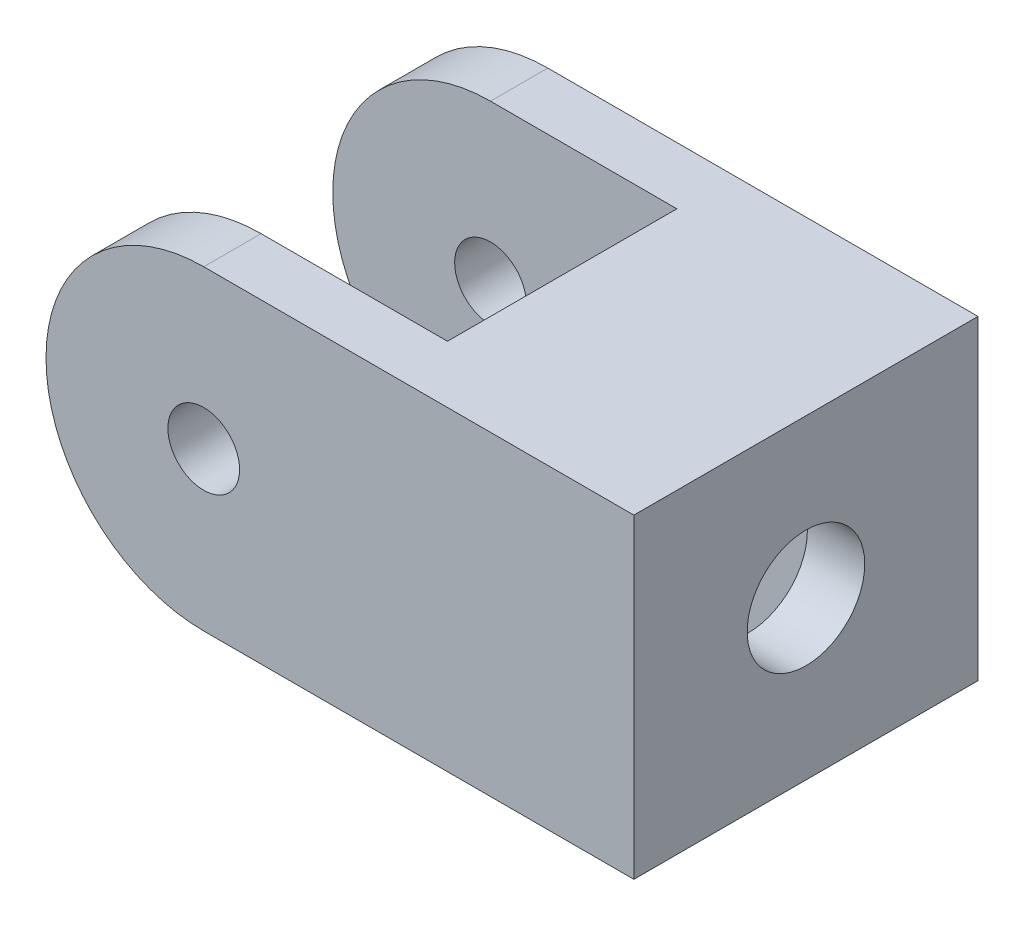
ISO-10303-21;
HEADER;
FILE_DESCRIPTION(('STEP AP214'),'2;1');
FILE_NAME('part.step','',(''),(''),'','','');
FILE_SCHEMA(('AUTOMOTIVE_DESIGN { 1 0 10303 214 1 1 1 1 }'));
ENDSEC;
DATA;
#1=APPLICATION_CONTEXT('core data for automotive mechanical design processes');
#2=APPLICATION_PROTOCOL_DEFINITION('international standard','automotive_design',2000,#1);
#3=PRODUCT_CONTEXT('',#1,'mechanical');
#4=PRODUCT('Part','Part','',(#3));
#5=PRODUCT_RELATED_PRODUCT_CATEGORY('part','',(#4));
#6=PRODUCT_DEFINITION_FORMATION('','',#4);
#7=PRODUCT_DEFINITION_CONTEXT('part definition',#1,'design');
#8=PRODUCT_DEFINITION('design','',#6,#7);
#9=PRODUCT_DEFINITION_SHAPE('','',#8);
#10=(LENGTH_UNIT() NAMED_UNIT(*) SI_UNIT(.MILLI.,.METRE.));
#11=(NAMED_UNIT(*) PLANE_ANGLE_UNIT() SI_UNIT($,.RADIAN.));
#12=(NAMED_UNIT(*) SI_UNIT($,.STERADIAN.) SOLID_ANGLE_UNIT());
#13=UNCERTAINTY_MEASURE_WITH_UNIT(LENGTH_MEASURE(1.E-05),#10,'distance_accuracy_value','');
#14=(GEOMETRIC_REPRESENTATION_CONTEXT(3) GLOBAL_UNCERTAINTY_ASSIGNED_CONTEXT((#13)) GLOBAL_UNIT_ASSIGNED_CONTEXT((#10,
#11,#12)) REPRESENTATION_CONTEXT('',''));
#15=CARTESIAN_POINT('',(0.,0.,0.));
#16=DIRECTION('',(0.,0.,1.));
#17=DIRECTION('',(1.,0.,0.));
#18=AXIS2_PLACEMENT_3D('',#15,#16,#17);
#19=CARTESIAN_POINT('',(30.,-11.,24.));
#20=DIRECTION('',(0.,1.,0.));
#21=DIRECTION('',(0.,0.,1.));
#22=AXIS2_PLACEMENT_3D('',#19,#20,#21);
#23=PLANE('',#22);
#24=DIRECTION('',(0.,0.,-1.));
#25=VECTOR('',#24,1.);
#26=CARTESIAN_POINT('',(13.,-11.,4.));
#27=LINE('',#26,#25);
#28=CARTESIAN_POINT('',(13.,-11.,20.));
#29=VERTEX_POINT('',#28);
#30=CARTESIAN_POINT('',(13.,-11.,4.));
#31=VERTEX_POINT('',#30);
#32=EDGE_CURVE('E166',#29,#31,#27,.T.);
#33=ORIENTED_EDGE('',*,*,#32,.T.);
#34=DIRECTION('',(-1.,0.,0.));
#35=VECTOR('',#34,1.);
#36=CARTESIAN_POINT('',(-11.,-11.,4.));
#37=LINE('',#36,#35);
#38=CARTESIAN_POINT('',(0.,-11.,4.));
#39=VERTEX_POINT('',#38);
#40=EDGE_CURVE('E170',#31,#39,#37,.T.);
#41=ORIENTED_EDGE('',*,*,#40,.T.);
#42=DIRECTION('',(0.,0.,-1.));
#43=VECTOR('',#42,1.);
#44=CARTESIAN_POINT('',(0.,-11.,24.));
#45=LINE('',#44,#43);
#46=CARTESIAN_POINT('',(0.,-11.,0.));
#47=VERTEX_POINT('',#46);
#48=EDGE_CURVE('E44',#39,#47,#45,.T.);
#49=ORIENTED_EDGE('',*,*,#48,.T.);
#50=DIRECTION('',(1.,0.,0.));
#51=VECTOR('',#50,1.);
#52=CARTESIAN_POINT('',(30.,-11.,0.));
#53=LINE('',#52,#51);
#54=CARTESIAN_POINT('',(30.,-11.,0.));
#55=VERTEX_POINT('',#54);
#56=EDGE_CURVE('E211',#47,#55,#53,.T.);
#57=ORIENTED_EDGE('',*,*,#56,.T.);
#58=DIRECTION('',(0.,0.,-1.));
#59=VECTOR('',#58,1.);
#60=CARTESIAN_POINT('',(30.,-11.,24.));
#61=LINE('',#60,#59);
#62=CARTESIAN_POINT('',(30.,-11.,24.));
#63=VERTEX_POINT('',#62);
#64=EDGE_CURVE('E223',#63,#55,#61,.T.);
#65=ORIENTED_EDGE('',*,*,#64,.F.);
#66=DIRECTION('',(1.,0.,0.));
#67=VECTOR('',#66,1.);
#68=CARTESIAN_POINT('',(30.,-11.,24.));
#69=LINE('',#68,#67);
#70=CARTESIAN_POINT('',(0.,-11.,24.));
#71=VERTEX_POINT('',#70);
#72=EDGE_CURVE('E201',#71,#63,#69,.T.);
#73=ORIENTED_EDGE('',*,*,#72,.F.);
#74=CARTESIAN_POINT('',(0.,-11.,20.));
#75=VERTEX_POINT('',#74);
#76=EDGE_CURVE('E11',#71,#75,#45,.T.);
#77=ORIENTED_EDGE('',*,*,#76,.T.);
#78=DIRECTION('',(1.,0.,0.));
#79=VECTOR('',#78,1.);
#80=CARTESIAN_POINT('',(-11.,-11.,20.));
#81=LINE('',#80,#79);
#82=EDGE_CURVE('E163',#75,#29,#81,.T.);
#83=ORIENTED_EDGE('',*,*,#82,.T.);
#84=EDGE_LOOP('',(#33,#41,#49,#57,#65,#73,#77,#83));
#85=FACE_BOUND('',#84,.T.);
#86=DIRECTION('',(0.,0.,-1.));
#87=VECTOR('',#86,1.);
#88=CARTESIAN_POINT('',(19.2,-11.,0.));
#89=LINE('',#88,#87);
#90=CARTESIAN_POINT('',(19.2,-11.,18.5));
#91=VERTEX_POINT('',#90);
#92=CARTESIAN_POINT('',(19.2,-11.,5.5));
#93=VERTEX_POINT('',#92);
#94=EDGE_CURVE('E143',#91,#93,#89,.T.);
#95=ORIENTED_EDGE('',*,*,#94,.F.);
#96=DIRECTION('',(1.,0.,0.));
#97=VECTOR('',#96,1.);
#98=CARTESIAN_POINT('',(19.2,-11.,18.5));
#99=LINE('',#98,#97);
#100=CARTESIAN_POINT('',(26.,-11.,18.5));
#101=VERTEX_POINT('',#100);
#102=EDGE_CURVE('E177',#91,#101,#99,.T.);
#103=ORIENTED_EDGE('',*,*,#102,.T.);
#104=DIRECTION('',(0.,0.,-1.));
#105=VECTOR('',#104,1.);
#106=CARTESIAN_POINT('',(26.,-11.,0.));
#107=LINE('',#106,#105);
#108=CARTESIAN_POINT('',(26.,-11.,5.5));
#109=VERTEX_POINT('',#108);
#110=EDGE_CURVE('E155',#101,#109,#107,.T.);
#111=ORIENTED_EDGE('',*,*,#110,.T.);
#112=DIRECTION('',(1.,0.,0.));
#113=VECTOR('',#112,1.);
#114=CARTESIAN_POINT('',(19.2,-11.,5.5));
#115=LINE('',#114,#113);
#116=EDGE_CURVE('E136',#93,#109,#115,.T.);
#117=ORIENTED_EDGE('',*,*,#116,.F.);
#118=EDGE_LOOP('',(#95,#103,#111,#117));
#119=FACE_BOUND('',#118,.T.);
#120=ADVANCED_FACE('F35',(#85,#119),#23,.F.);
#121=CARTESIAN_POINT('',(0.,0.,24.));
#122=DIRECTION('',(0.,0.,-1.));
#123=DIRECTION('',(-1.,0.,0.));
#124=AXIS2_PLACEMENT_3D('',#121,#122,#123);
#125=CYLINDRICAL_SURFACE('',#124,11.);
#126=CARTESIAN_POINT('',(0.,0.,4.));
#127=DIRECTION('',(0.,0.,-1.));
#128=DIRECTION('',(-1.,0.,0.));
#129=AXIS2_PLACEMENT_3D('',#126,#127,#128);
#130=CIRCLE('',#129,11.);
#131=CARTESIAN_POINT('',(0.,11.,4.));
#132=VERTEX_POINT('',#131);
#133=EDGE_CURVE('E189',#39,#132,#130,.T.);
#134=ORIENTED_EDGE('',*,*,#133,.T.);
#135=DIRECTION('',(0.,0.,-1.));
#136=VECTOR('',#135,1.);
#137=CARTESIAN_POINT('',(0.,11.,24.));
#138=LINE('',#137,#136);
#139=CARTESIAN_POINT('',(0.,11.,0.));
#140=VERTEX_POINT('',#139);
#141=EDGE_CURVE('E208',#132,#140,#138,.T.);
#142=ORIENTED_EDGE('',*,*,#141,.T.);
#143=CARTESIAN_POINT('',(0.,0.,0.));
#144=DIRECTION('',(0.,0.,1.));
#145=DIRECTION('',(1.,0.,0.));
#146=AXIS2_PLACEMENT_3D('',#143,#144,#145);
#147=CIRCLE('',#146,11.);
#148=EDGE_CURVE('E195',#140,#47,#147,.T.);
#149=ORIENTED_EDGE('',*,*,#148,.T.);
#150=ORIENTED_EDGE('',*,*,#48,.F.);
#151=EDGE_LOOP('',(#134,#142,#149,#150));
#152=FACE_BOUND('',#151,.T.);
#153=ADVANCED_FACE('F237',(#152),#125,.T.);
#154=CARTESIAN_POINT('',(0.,0.,24.));
#155=DIRECTION('',(0.,0.,-1.));
#156=DIRECTION('',(-1.,0.,0.));
#157=AXIS2_PLACEMENT_3D('',#154,#155,#156);
#158=CYLINDRICAL_SURFACE('',#157,2.5);
#159=CARTESIAN_POINT('',(0.,0.,4.));
#160=DIRECTION('',(0.,0.,-1.));
#161=DIRECTION('',(-1.,0.,0.));
#162=AXIS2_PLACEMENT_3D('',#159,#160,#161);
#163=CIRCLE('',#162,2.5);
#164=CARTESIAN_POINT('',(-2.5,0.,4.));
#165=VERTEX_POINT('',#164);
#166=EDGE_CURVE('E188',#165,#165,#163,.T.);
#167=ORIENTED_EDGE('',*,*,#166,.F.);
#168=EDGE_LOOP('',(#167));
#169=FACE_BOUND('',#168,.T.);
#170=CARTESIAN_POINT('',(0.,0.,0.));
#171=DIRECTION('',(0.,0.,1.));
#172=DIRECTION('',(1.,0.,0.));
#173=AXIS2_PLACEMENT_3D('',#170,#171,#172);
#174=CIRCLE('',#173,2.5);
#175=CARTESIAN_POINT('',(2.5,0.,0.));
#176=VERTEX_POINT('',#175);
#177=EDGE_CURVE('E191',#176,#176,#174,.T.);
#178=ORIENTED_EDGE('',*,*,#177,.F.);
#179=EDGE_LOOP('',(#178));
#180=FACE_BOUND('',#179,.T.);
#181=ADVANCED_FACE('F233',(#169,#180),#158,.F.);
#182=CARTESIAN_POINT('',(0.,0.,24.));
#183=DIRECTION('',(0.,0.,1.));
#184=DIRECTION('',(1.,0.,0.));
#185=AXIS2_PLACEMENT_3D('',#182,#183,#184);
#186=PLANE('',#185);
#187=CARTESIAN_POINT('',(0.,0.,24.));
#188=DIRECTION('',(0.,0.,1.));
#189=DIRECTION('',(1.,0.,0.));
#190=AXIS2_PLACEMENT_3D('',#187,#188,#189);
#191=CIRCLE('',#190,11.);
#192=CARTESIAN_POINT('',(0.,11.,24.));
#193=VERTEX_POINT('',#192);
#194=EDGE_CURVE('E198',#193,#71,#191,.T.);
#195=ORIENTED_EDGE('',*,*,#194,.T.);
#196=ORIENTED_EDGE('',*,*,#72,.T.);
#197=DIRECTION('',(0.,1.,0.));
#198=VECTOR('',#197,1.);
#199=CARTESIAN_POINT('',(30.,11.,24.));
#200=LINE('',#199,#198);
#201=CARTESIAN_POINT('',(30.,11.,24.));
#202=VERTEX_POINT('',#201);
#203=EDGE_CURVE('E204',#63,#202,#200,.T.);
#204=ORIENTED_EDGE('',*,*,#203,.T.);
#205=DIRECTION('',(-1.,0.,0.));
#206=VECTOR('',#205,1.);
#207=CARTESIAN_POINT('',(0.,11.,24.));
#208=LINE('',#207,#206);
#209=EDGE_CURVE('E206',#202,#193,#208,.T.);
#210=ORIENTED_EDGE('',*,*,#209,.T.);
#211=EDGE_LOOP('',(#195,#196,#204,#210));
#212=FACE_BOUND('',#211,.T.);
#213=CARTESIAN_POINT('',(0.,0.,24.));
#214=DIRECTION('',(0.,0.,1.));
#215=DIRECTION('',(1.,0.,0.));
#216=AXIS2_PLACEMENT_3D('',#213,#214,#215);
#217=CIRCLE('',#216,2.5);
#218=CARTESIAN_POINT('',(2.5,0.,24.));
#219=VERTEX_POINT('',#218);
#220=EDGE_CURVE('E192',#219,#219,#217,.T.);
#221=ORIENTED_EDGE('',*,*,#220,.F.);
#222=EDGE_LOOP('',(#221));
#223=FACE_BOUND('',#222,.T.);
#224=ADVANCED_FACE('F236',(#212,#223),#186,.T.);
#225=CARTESIAN_POINT('',(0.,0.,0.));
#226=DIRECTION('',(0.,0.,1.));
#227=DIRECTION('',(1.,0.,0.));
#228=AXIS2_PLACEMENT_3D('',#225,#226,#227);
#229=PLANE('',#228);
#230=ORIENTED_EDGE('',*,*,#148,.F.);
#231=DIRECTION('',(-1.,0.,0.));
#232=VECTOR('',#231,1.);
#233=CARTESIAN_POINT('',(0.,11.,0.));
#234=LINE('',#233,#232);
#235=CARTESIAN_POINT('',(30.,11.,0.));
#236=VERTEX_POINT('',#235);
#237=EDGE_CURVE('E202',#236,#140,#234,.T.);
#238=ORIENTED_EDGE('',*,*,#237,.F.);
#239=DIRECTION('',(0.,1.,0.));
#240=VECTOR('',#239,1.);
#241=CARTESIAN_POINT('',(30.,11.,0.));
#242=LINE('',#241,#240);
#243=EDGE_CURVE('E213',#55,#236,#242,.T.);
#244=ORIENTED_EDGE('',*,*,#243,.F.);
#245=ORIENTED_EDGE('',*,*,#56,.F.);
#246=EDGE_LOOP('',(#230,#238,#244,#245));
#247=FACE_BOUND('',#246,.T.);
#248=ORIENTED_EDGE('',*,*,#177,.T.);
#249=EDGE_LOOP('',(#248));
#250=FACE_BOUND('',#249,.T.);
#251=ADVANCED_FACE('F242',(#247,#250),#229,.F.);
#252=CARTESIAN_POINT('',(0.,11.,20.));
#253=VERTEX_POINT('',#252);
#254=EDGE_CURVE('E217',#193,#253,#138,.T.);
#255=ORIENTED_EDGE('',*,*,#254,.T.);
#256=CARTESIAN_POINT('',(0.,0.,20.));
#257=DIRECTION('',(0.,0.,1.));
#258=DIRECTION('',(1.,0.,0.));
#259=AXIS2_PLACEMENT_3D('',#256,#257,#258);
#260=CIRCLE('',#259,11.);
#261=EDGE_CURVE('E60',#253,#75,#260,.T.);
#262=ORIENTED_EDGE('',*,*,#261,.T.);
#263=ORIENTED_EDGE('',*,*,#76,.F.);
#264=ORIENTED_EDGE('',*,*,#194,.F.);
#265=EDGE_LOOP('',(#255,#262,#263,#264));
#266=FACE_BOUND('',#265,.T.);
#267=ADVANCED_FACE('F37',(#266),#125,.T.);
#268=CARTESIAN_POINT('',(30.,11.,24.));
#269=DIRECTION('',(-1.,0.,0.));
#270=DIRECTION('',(0.,0.,1.));
#271=AXIS2_PLACEMENT_3D('',#268,#269,#270);
#272=PLANE('',#271);
#273=CARTESIAN_POINT('',(30.,0.,12.));
#274=DIRECTION('',(1.,0.,0.));
#275=DIRECTION('',(0.,0.,-1.));
#276=AXIS2_PLACEMENT_3D('',#273,#274,#275);
#277=CIRCLE('',#276,4.1);
#278=CARTESIAN_POINT('',(30.,0.,7.9));
#279=VERTEX_POINT('',#278);
#280=EDGE_CURVE('E340',#279,#279,#277,.T.);
#281=ORIENTED_EDGE('',*,*,#280,.F.);
#282=EDGE_LOOP('',(#281));
#283=FACE_BOUND('',#282,.T.);
#284=ORIENTED_EDGE('',*,*,#243,.T.);
#285=DIRECTION('',(0.,0.,-1.));
#286=VECTOR('',#285,1.);
#287=CARTESIAN_POINT('',(30.,11.,24.));
#288=LINE('',#287,#286);
#289=EDGE_CURVE('E220',#202,#236,#288,.T.);
#290=ORIENTED_EDGE('',*,*,#289,.F.);
#291=ORIENTED_EDGE('',*,*,#203,.F.);
#292=ORIENTED_EDGE('',*,*,#64,.T.);
#293=EDGE_LOOP('',(#284,#290,#291,#292));
#294=FACE_BOUND('',#293,.T.);
#295=ADVANCED_FACE('F250',(#283,#294),#272,.F.);
#296=CARTESIAN_POINT('',(0.,11.,24.));
#297=DIRECTION('',(0.,-1.,0.));
#298=DIRECTION('',(0.,0.,-1.));
#299=AXIS2_PLACEMENT_3D('',#296,#297,#298);
#300=PLANE('',#299);
#301=ORIENTED_EDGE('',*,*,#141,.F.);
#302=DIRECTION('',(-1.,0.,0.));
#303=VECTOR('',#302,1.);
#304=CARTESIAN_POINT('',(-11.,11.,4.));
#305=LINE('',#304,#303);
#306=CARTESIAN_POINT('',(13.,11.,4.));
#307=VERTEX_POINT('',#306);
#308=EDGE_CURVE('E167',#307,#132,#305,.T.);
#309=ORIENTED_EDGE('',*,*,#308,.F.);
#310=DIRECTION('',(0.,0.,-1.));
#311=VECTOR('',#310,1.);
#312=CARTESIAN_POINT('',(13.,11.,4.));
#313=LINE('',#312,#311);
#314=CARTESIAN_POINT('',(13.,11.,20.));
#315=VERTEX_POINT('',#314);
#316=EDGE_CURVE('E176',#315,#307,#313,.T.);
#317=ORIENTED_EDGE('',*,*,#316,.F.);
#318=DIRECTION('',(1.,0.,0.));
#319=VECTOR('',#318,1.);
#320=CARTESIAN_POINT('',(-11.,11.,20.));
#321=LINE('',#320,#319);
#322=EDGE_CURVE('E174',#253,#315,#321,.T.);
#323=ORIENTED_EDGE('',*,*,#322,.F.);
#324=ORIENTED_EDGE('',*,*,#254,.F.);
#325=ORIENTED_EDGE('',*,*,#209,.F.);
#326=ORIENTED_EDGE('',*,*,#289,.T.);
#327=ORIENTED_EDGE('',*,*,#237,.T.);
#328=EDGE_LOOP('',(#301,#309,#317,#323,#324,#325,#326,#327));
#329=FACE_BOUND('',#328,.T.);
#330=ADVANCED_FACE('F264',(#329),#300,.F.);
#331=CARTESIAN_POINT('',(0.,0.,20.));
#332=DIRECTION('',(0.,0.,1.));
#333=DIRECTION('',(1.,0.,0.));
#334=AXIS2_PLACEMENT_3D('',#331,#332,#333);
#335=CIRCLE('',#334,2.5);
#336=CARTESIAN_POINT('',(2.5,0.,20.));
#337=VERTEX_POINT('',#336);
#338=EDGE_CURVE('E184',#337,#337,#335,.T.);
#339=ORIENTED_EDGE('',*,*,#338,.F.);
#340=EDGE_LOOP('',(#339));
#341=FACE_BOUND('',#340,.T.);
#342=ORIENTED_EDGE('',*,*,#220,.T.);
#343=EDGE_LOOP('',(#342));
#344=FACE_BOUND('',#343,.T.);
#345=ADVANCED_FACE('F239',(#341,#344),#158,.F.);
#346=CARTESIAN_POINT('',(-11.,-11.,4.));
#347=DIRECTION('',(0.,0.,-1.));
#348=DIRECTION('',(-1.,0.,0.));
#349=AXIS2_PLACEMENT_3D('',#346,#347,#348);
#350=PLANE('',#349);
#351=ORIENTED_EDGE('',*,*,#166,.T.);
#352=EDGE_LOOP('',(#351));
#353=FACE_BOUND('',#352,.T.);
#354=ORIENTED_EDGE('',*,*,#133,.F.);
#355=ORIENTED_EDGE('',*,*,#40,.F.);
#356=DIRECTION('',(0.,1.,0.));
#357=VECTOR('',#356,1.);
#358=CARTESIAN_POINT('',(13.,-11.,4.));
#359=LINE('',#358,#357);
#360=EDGE_CURVE('E182',#31,#307,#359,.T.);
#361=ORIENTED_EDGE('',*,*,#360,.T.);
#362=ORIENTED_EDGE('',*,*,#308,.T.);
#363=EDGE_LOOP('',(#354,#355,#361,#362));
#364=FACE_BOUND('',#363,.T.);
#365=ADVANCED_FACE('F230',(#353,#364),#350,.F.);
#366=CARTESIAN_POINT('',(-11.,-11.,20.));
#367=DIRECTION('',(0.,0.,1.));
#368=DIRECTION('',(1.,0.,0.));
#369=AXIS2_PLACEMENT_3D('',#366,#367,#368);
#370=PLANE('',#369);
#371=ORIENTED_EDGE('',*,*,#338,.T.);
#372=EDGE_LOOP('',(#371));
#373=FACE_BOUND('',#372,.T.);
#374=ORIENTED_EDGE('',*,*,#322,.T.);
#375=DIRECTION('',(0.,1.,0.));
#376=VECTOR('',#375,1.);
#377=CARTESIAN_POINT('',(13.,-11.,20.));
#378=LINE('',#377,#376);
#379=EDGE_CURVE('E173',#29,#315,#378,.T.);
#380=ORIENTED_EDGE('',*,*,#379,.F.);
#381=ORIENTED_EDGE('',*,*,#82,.F.);
#382=ORIENTED_EDGE('',*,*,#261,.F.);
#383=EDGE_LOOP('',(#374,#380,#381,#382));
#384=FACE_BOUND('',#383,.T.);
#385=ADVANCED_FACE('F292',(#373,#384),#370,.F.);
#386=CARTESIAN_POINT('',(13.,-11.,4.));
#387=DIRECTION('',(1.,0.,0.));
#388=DIRECTION('',(0.,0.,-1.));
#389=AXIS2_PLACEMENT_3D('',#386,#387,#388);
#390=PLANE('',#389);
#391=CARTESIAN_POINT('',(13.,0.,12.));
#392=DIRECTION('',(1.,0.,0.));
#393=DIRECTION('',(0.,0.,-1.));
#394=AXIS2_PLACEMENT_3D('',#391,#392,#393);
#395=CIRCLE('',#394,4.1);
#396=CARTESIAN_POINT('',(13.,0.,7.9));
#397=VERTEX_POINT('',#396);
#398=EDGE_CURVE('E339',#397,#397,#395,.F.);
#399=ORIENTED_EDGE('',*,*,#398,.F.);
#400=EDGE_LOOP('',(#399));
#401=FACE_BOUND('',#400,.T.);
#402=ORIENTED_EDGE('',*,*,#316,.T.);
#403=ORIENTED_EDGE('',*,*,#360,.F.);
#404=ORIENTED_EDGE('',*,*,#32,.F.);
#405=ORIENTED_EDGE('',*,*,#379,.T.);
#406=EDGE_LOOP('',(#402,#403,#404,#405));
#407=FACE_BOUND('',#406,.T.);
#408=ADVANCED_FACE('F280',(#401,#407),#390,.F.);
#409=CARTESIAN_POINT('',(19.2,0.,18.5));
#410=DIRECTION('',(0.,0.,1.));
#411=DIRECTION('',(1.,0.,0.));
#412=AXIS2_PLACEMENT_3D('',#409,#410,#411);
#413=PLANE('',#412);
#414=DIRECTION('',(0.,-1.,0.));
#415=VECTOR('',#414,1.);
#416=CARTESIAN_POINT('',(26.,0.,18.5));
#417=LINE('',#416,#415);
#418=CARTESIAN_POINT('',(26.,3.75277674973257,18.5));
#419=VERTEX_POINT('',#418);
#420=EDGE_CURVE('E153',#419,#101,#417,.T.);
#421=ORIENTED_EDGE('',*,*,#420,.T.);
#422=ORIENTED_EDGE('',*,*,#102,.F.);
#423=DIRECTION('',(0.,-1.,0.));
#424=VECTOR('',#423,1.);
#425=CARTESIAN_POINT('',(19.2,0.,18.5));
#426=LINE('',#425,#424);
#427=CARTESIAN_POINT('',(19.2,3.75277674973257,18.5));
#428=VERTEX_POINT('',#427);
#429=EDGE_CURVE('E150',#428,#91,#426,.T.);
#430=ORIENTED_EDGE('',*,*,#429,.F.);
#431=DIRECTION('',(1.,0.,0.));
#432=VECTOR('',#431,1.);
#433=CARTESIAN_POINT('',(19.2,3.75277674973257,18.5));
#434=LINE('',#433,#432);
#435=EDGE_CURVE('E360',#428,#419,#434,.T.);
#436=ORIENTED_EDGE('',*,*,#435,.T.);
#437=EDGE_LOOP('',(#421,#422,#430,#436));
#438=FACE_BOUND('',#437,.T.);
#439=ADVANCED_FACE('F300',(#438),#413,.F.);
#440=CARTESIAN_POINT('',(19.2,10.8253175473055,6.25));
#441=DIRECTION('',(0.,0.866025403784439,0.5));
#442=DIRECTION('',(0.,-0.5,0.866025403784439));
#443=AXIS2_PLACEMENT_3D('',#440,#441,#442);
#444=PLANE('',#443);
#445=DIRECTION('',(0.,-0.5,0.866025403784439));
#446=VECTOR('',#445,1.);
#447=CARTESIAN_POINT('',(26.,10.8253175473055,6.25));
#448=LINE('',#447,#446);
#449=CARTESIAN_POINT('',(26.,7.50555349946514,12.));
#450=VERTEX_POINT('',#449);
#451=EDGE_CURVE('E354',#450,#419,#448,.T.);
#452=ORIENTED_EDGE('',*,*,#451,.T.);
#453=ORIENTED_EDGE('',*,*,#435,.F.);
#454=DIRECTION('',(0.,-0.5,0.866025403784439));
#455=VECTOR('',#454,1.);
#456=CARTESIAN_POINT('',(19.2,10.8253175473055,6.25));
#457=LINE('',#456,#455);
#458=CARTESIAN_POINT('',(19.2,7.50555349946514,12.));
#459=VERTEX_POINT('',#458);
#460=EDGE_CURVE('E159',#459,#428,#457,.T.);
#461=ORIENTED_EDGE('',*,*,#460,.F.);
#462=DIRECTION('',(1.,0.,0.));
#463=VECTOR('',#462,1.);
#464=CARTESIAN_POINT('',(19.2,7.50555349946514,12.));
#465=LINE('',#464,#463);
#466=EDGE_CURVE('E157',#459,#450,#465,.T.);
#467=ORIENTED_EDGE('',*,*,#466,.T.);
#468=EDGE_LOOP('',(#452,#453,#461,#467));
#469=FACE_BOUND('',#468,.T.);
#470=ADVANCED_FACE('F310',(#469),#444,.F.);
#471=CARTESIAN_POINT('',(19.2,0.43301270189222,-0.250000000000001));
#472=DIRECTION('',(0.,0.866025403784439,-0.5));
#473=DIRECTION('',(0.,0.5,0.866025403784438));
#474=AXIS2_PLACEMENT_3D('',#471,#472,#473);
#475=PLANE('',#474);
#476=DIRECTION('',(0.,0.5,0.866025403784439));
#477=VECTOR('',#476,1.);
#478=CARTESIAN_POINT('',(26.,0.43301270189222,-0.250000000000001));
#479=LINE('',#478,#477);
#480=CARTESIAN_POINT('',(26.,3.75277674973257,5.5));
#481=VERTEX_POINT('',#480);
#482=EDGE_CURVE('E351',#481,#450,#479,.T.);
#483=ORIENTED_EDGE('',*,*,#482,.T.);
#484=ORIENTED_EDGE('',*,*,#466,.F.);
#485=DIRECTION('',(0.,0.5,0.866025403784439));
#486=VECTOR('',#485,1.);
#487=CARTESIAN_POINT('',(19.2,0.43301270189222,-0.250000000000001));
#488=LINE('',#487,#486);
#489=CARTESIAN_POINT('',(19.2,3.75277674973257,5.5));
#490=VERTEX_POINT('',#489);
#491=EDGE_CURVE('E142',#490,#459,#488,.T.);
#492=ORIENTED_EDGE('',*,*,#491,.F.);
#493=DIRECTION('',(1.,0.,0.));
#494=VECTOR('',#493,1.);
#495=CARTESIAN_POINT('',(19.2,3.75277674973257,5.5));
#496=LINE('',#495,#494);
#497=EDGE_CURVE('E138',#490,#481,#496,.T.);
#498=ORIENTED_EDGE('',*,*,#497,.T.);
#499=EDGE_LOOP('',(#483,#484,#492,#498));
#500=FACE_BOUND('',#499,.T.);
#501=ADVANCED_FACE('F307',(#500),#475,.F.);
#502=CARTESIAN_POINT('',(19.2,0.,5.5));
#503=DIRECTION('',(0.,0.,-1.));
#504=DIRECTION('',(0.,1.,0.));
#505=AXIS2_PLACEMENT_3D('',#502,#503,#504);
#506=PLANE('',#505);
#507=DIRECTION('',(0.,1.,0.));
#508=VECTOR('',#507,1.);
#509=CARTESIAN_POINT('',(26.,0.,5.5));
#510=LINE('',#509,#508);
#511=EDGE_CURVE('E52',#109,#481,#510,.T.);
#512=ORIENTED_EDGE('',*,*,#511,.T.);
#513=ORIENTED_EDGE('',*,*,#497,.F.);
#514=DIRECTION('',(0.,1.,0.));
#515=VECTOR('',#514,1.);
#516=CARTESIAN_POINT('',(19.2,0.,5.5));
#517=LINE('',#516,#515);
#518=EDGE_CURVE('E132',#93,#490,#517,.T.);
#519=ORIENTED_EDGE('',*,*,#518,.F.);
#520=ORIENTED_EDGE('',*,*,#116,.T.);
#521=EDGE_LOOP('',(#512,#513,#519,#520));
#522=FACE_BOUND('',#521,.T.);
#523=ADVANCED_FACE('F134',(#522),#506,.F.);
#524=CARTESIAN_POINT('',(19.2,0.,0.));
#525=DIRECTION('',(1.,0.,0.));
#526=DIRECTION('',(0.,0.,-1.));
#527=AXIS2_PLACEMENT_3D('',#524,#525,#526);
#528=PLANE('',#527);
#529=CARTESIAN_POINT('',(19.2,0.,12.));
#530=DIRECTION('',(1.,0.,0.));
#531=DIRECTION('',(0.,0.,-1.));
#532=AXIS2_PLACEMENT_3D('',#529,#530,#531);
#533=CIRCLE('',#532,4.1);
#534=CARTESIAN_POINT('',(19.2,0.,7.9));
#535=VERTEX_POINT('',#534);
#536=EDGE_CURVE('E336',#535,#535,#533,.T.);
#537=ORIENTED_EDGE('',*,*,#536,.F.);
#538=EDGE_LOOP('',(#537));
#539=FACE_BOUND('',#538,.T.);
#540=ORIENTED_EDGE('',*,*,#94,.T.);
#541=ORIENTED_EDGE('',*,*,#518,.T.);
#542=ORIENTED_EDGE('',*,*,#491,.T.);
#543=ORIENTED_EDGE('',*,*,#460,.T.);
#544=ORIENTED_EDGE('',*,*,#429,.T.);
#545=EDGE_LOOP('',(#540,#541,#542,#543,#544));
#546=FACE_BOUND('',#545,.T.);
#547=ADVANCED_FACE('F147',(#539,#546),#528,.T.);
#548=CARTESIAN_POINT('',(26.,0.,0.));
#549=DIRECTION('',(1.,0.,0.));
#550=DIRECTION('',(0.,0.,-1.));
#551=AXIS2_PLACEMENT_3D('',#548,#549,#550);
#552=PLANE('',#551);
#553=CARTESIAN_POINT('',(26.,0.,12.));
#554=DIRECTION('',(1.,0.,0.));
#555=DIRECTION('',(0.,0.,-1.));
#556=AXIS2_PLACEMENT_3D('',#553,#554,#555);
#557=CIRCLE('',#556,4.1);
#558=CARTESIAN_POINT('',(26.,0.,7.9));
#559=VERTEX_POINT('',#558);
#560=EDGE_CURVE('E39',#559,#559,#557,.T.);
#561=ORIENTED_EDGE('',*,*,#560,.T.);
#562=EDGE_LOOP('',(#561));
#563=FACE_BOUND('',#562,.T.);
#564=ORIENTED_EDGE('',*,*,#110,.F.);
#565=ORIENTED_EDGE('',*,*,#420,.F.);
#566=ORIENTED_EDGE('',*,*,#451,.F.);
#567=ORIENTED_EDGE('',*,*,#482,.F.);
#568=ORIENTED_EDGE('',*,*,#511,.F.);
#569=EDGE_LOOP('',(#564,#565,#566,#567,#568));
#570=FACE_BOUND('',#569,.T.);
#571=ADVANCED_FACE('F318',(#563,#570),#552,.F.);
#572=CARTESIAN_POINT('',(1.40344878854062,0.,12.));
#573=DIRECTION('',(1.,0.,0.));
#574=DIRECTION('',(0.,0.,-1.));
#575=AXIS2_PLACEMENT_3D('',#572,#573,#574);
#576=CYLINDRICAL_SURFACE('',#575,4.1);
#577=ORIENTED_EDGE('',*,*,#280,.T.);
#578=EDGE_LOOP('',(#577));
#579=FACE_BOUND('',#578,.T.);
#580=ORIENTED_EDGE('',*,*,#560,.F.);
#581=EDGE_LOOP('',(#580));
#582=FACE_BOUND('',#581,.T.);
#583=ADVANCED_FACE('F321',(#579,#582),#576,.F.);
#584=ORIENTED_EDGE('',*,*,#536,.T.);
#585=EDGE_LOOP('',(#584));
#586=FACE_BOUND('',#585,.T.);
#587=ORIENTED_EDGE('',*,*,#398,.T.);
#588=EDGE_LOOP('',(#587));
#589=FACE_BOUND('',#588,.T.);
#590=ADVANCED_FACE('F326',(#586,#589),#576,.F.);
#591=CLOSED_SHELL('',(#120,#153,#181,#224,#251,#267,#295,#330,#345,#365,#385,#408,#439,#470,
#501,#523,#547,#571,#583,#590));
#592=MANIFOLD_SOLID_BREP('B2',#591);
#593=ADVANCED_BREP_SHAPE_REPRESENTATION('',(#18,#592),#14);
#594=SHAPE_DEFINITION_REPRESENTATION(#9,#593);
ENDSEC;
END-ISO-10303-21;
